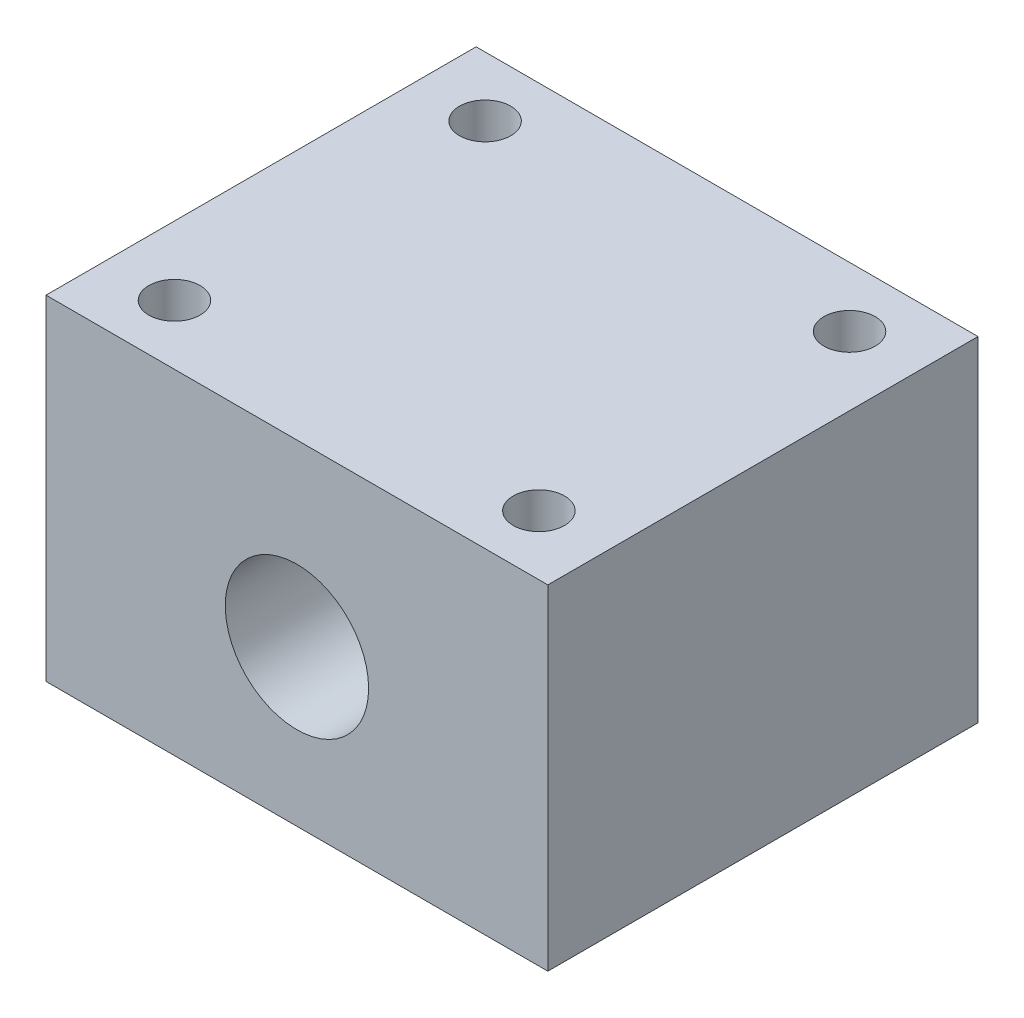
ISO-10303-21;
HEADER;
FILE_DESCRIPTION(('STEP AP214'),'2;1');
FILE_NAME('part.step','',(''),(''),'','','');
FILE_SCHEMA(('AUTOMOTIVE_DESIGN { 1 0 10303 214 1 1 1 1 }'));
ENDSEC;
DATA;
#1=APPLICATION_CONTEXT('core data for automotive mechanical design processes');
#2=APPLICATION_PROTOCOL_DEFINITION('international standard','automotive_design',2000,#1);
#3=PRODUCT_CONTEXT('',#1,'mechanical');
#4=PRODUCT('Part','Part','',(#3));
#5=PRODUCT_RELATED_PRODUCT_CATEGORY('part','',(#4));
#6=PRODUCT_DEFINITION_FORMATION('','',#4);
#7=PRODUCT_DEFINITION_CONTEXT('part definition',#1,'design');
#8=PRODUCT_DEFINITION('design','',#6,#7);
#9=PRODUCT_DEFINITION_SHAPE('','',#8);
#10=(LENGTH_UNIT() NAMED_UNIT(*) SI_UNIT(.MILLI.,.METRE.));
#11=(NAMED_UNIT(*) PLANE_ANGLE_UNIT() SI_UNIT($,.RADIAN.));
#12=(NAMED_UNIT(*) SI_UNIT($,.STERADIAN.) SOLID_ANGLE_UNIT());
#13=UNCERTAINTY_MEASURE_WITH_UNIT(LENGTH_MEASURE(1.E-05),#10,'distance_accuracy_value','');
#14=(GEOMETRIC_REPRESENTATION_CONTEXT(3) GLOBAL_UNCERTAINTY_ASSIGNED_CONTEXT((#13)) GLOBAL_UNIT_ASSIGNED_CONTEXT((#10,
#11,#12)) REPRESENTATION_CONTEXT('',''));
#15=CARTESIAN_POINT('',(0.,0.,0.));
#16=DIRECTION('',(0.,0.,1.));
#17=DIRECTION('',(1.,0.,0.));
#18=AXIS2_PLACEMENT_3D('',#15,#16,#17);
#19=CARTESIAN_POINT('',(-21.,-13.,36.));
#20=DIRECTION('',(0.,0.,1.));
#21=DIRECTION('',(1.,0.,0.));
#22=AXIS2_PLACEMENT_3D('',#19,#20,#21);
#23=PLANE('',#22);
#24=DIRECTION('',(0.,-1.,0.));
#25=VECTOR('',#24,1.);
#26=CARTESIAN_POINT('',(-21.,15.,36.));
#27=LINE('',#26,#25);
#28=CARTESIAN_POINT('',(-21.,15.,36.));
#29=VERTEX_POINT('',#28);
#30=CARTESIAN_POINT('',(-21.,-13.,36.));
#31=VERTEX_POINT('',#30);
#32=EDGE_CURVE('E85',#29,#31,#27,.T.);
#33=ORIENTED_EDGE('',*,*,#32,.T.);
#34=DIRECTION('',(1.,0.,0.));
#35=VECTOR('',#34,1.);
#36=CARTESIAN_POINT('',(-21.,-13.,36.));
#37=LINE('',#36,#35);
#38=CARTESIAN_POINT('',(21.,-13.,36.));
#39=VERTEX_POINT('',#38);
#40=EDGE_CURVE('E80',#31,#39,#37,.T.);
#41=ORIENTED_EDGE('',*,*,#40,.T.);
#42=DIRECTION('',(0.,1.,0.));
#43=VECTOR('',#42,1.);
#44=CARTESIAN_POINT('',(21.,15.,36.));
#45=LINE('',#44,#43);
#46=CARTESIAN_POINT('',(21.,15.,36.));
#47=VERTEX_POINT('',#46);
#48=EDGE_CURVE('E83',#39,#47,#45,.T.);
#49=ORIENTED_EDGE('',*,*,#48,.T.);
#50=DIRECTION('',(-1.,0.,0.));
#51=VECTOR('',#50,1.);
#52=CARTESIAN_POINT('',(-21.,15.,36.));
#53=LINE('',#52,#51);
#54=EDGE_CURVE('E50',#47,#29,#53,.T.);
#55=ORIENTED_EDGE('',*,*,#54,.T.);
#56=EDGE_LOOP('',(#33,#41,#49,#55));
#57=FACE_BOUND('',#56,.T.);
#58=CARTESIAN_POINT('',(0.,0.,36.));
#59=DIRECTION('',(0.,0.,1.));
#60=DIRECTION('',(1.,0.,0.));
#61=AXIS2_PLACEMENT_3D('',#58,#59,#60);
#62=CIRCLE('',#61,6.);
#63=CARTESIAN_POINT('',(6.,0.,36.));
#64=VERTEX_POINT('',#63);
#65=EDGE_CURVE('E100',#64,#64,#62,.T.);
#66=ORIENTED_EDGE('',*,*,#65,.F.);
#67=EDGE_LOOP('',(#66));
#68=FACE_BOUND('',#67,.T.);
#69=ADVANCED_FACE('F33',(#57,#68),#23,.T.);
#70=CARTESIAN_POINT('',(-21.,-13.,0.));
#71=DIRECTION('',(0.,0.,1.));
#72=DIRECTION('',(1.,0.,0.));
#73=AXIS2_PLACEMENT_3D('',#70,#71,#72);
#74=PLANE('',#73);
#75=DIRECTION('',(0.,-1.,0.));
#76=VECTOR('',#75,1.);
#77=CARTESIAN_POINT('',(-21.,15.,0.));
#78=LINE('',#77,#76);
#79=CARTESIAN_POINT('',(-21.,15.,0.));
#80=VERTEX_POINT('',#79);
#81=CARTESIAN_POINT('',(-21.,-13.,0.));
#82=VERTEX_POINT('',#81);
#83=EDGE_CURVE('E97',#80,#82,#78,.T.);
#84=ORIENTED_EDGE('',*,*,#83,.F.);
#85=DIRECTION('',(-1.,0.,0.));
#86=VECTOR('',#85,1.);
#87=CARTESIAN_POINT('',(-21.,15.,0.));
#88=LINE('',#87,#86);
#89=CARTESIAN_POINT('',(21.,15.,0.));
#90=VERTEX_POINT('',#89);
#91=EDGE_CURVE('E73',#90,#80,#88,.T.);
#92=ORIENTED_EDGE('',*,*,#91,.F.);
#93=DIRECTION('',(0.,1.,0.));
#94=VECTOR('',#93,1.);
#95=CARTESIAN_POINT('',(21.,15.,0.));
#96=LINE('',#95,#94);
#97=CARTESIAN_POINT('',(21.,-13.,0.));
#98=VERTEX_POINT('',#97);
#99=EDGE_CURVE('E67',#98,#90,#96,.T.);
#100=ORIENTED_EDGE('',*,*,#99,.F.);
#101=DIRECTION('',(1.,0.,0.));
#102=VECTOR('',#101,1.);
#103=CARTESIAN_POINT('',(-21.,-13.,0.));
#104=LINE('',#103,#102);
#105=EDGE_CURVE('E89',#82,#98,#104,.T.);
#106=ORIENTED_EDGE('',*,*,#105,.F.);
#107=EDGE_LOOP('',(#84,#92,#100,#106));
#108=FACE_BOUND('',#107,.T.);
#109=CARTESIAN_POINT('',(0.,0.,0.));
#110=DIRECTION('',(0.,0.,1.));
#111=DIRECTION('',(1.,0.,0.));
#112=AXIS2_PLACEMENT_3D('',#109,#110,#111);
#113=CIRCLE('',#112,6.);
#114=CARTESIAN_POINT('',(6.,0.,0.));
#115=VERTEX_POINT('',#114);
#116=EDGE_CURVE('E112',#115,#115,#113,.T.);
#117=ORIENTED_EDGE('',*,*,#116,.T.);
#118=EDGE_LOOP('',(#117));
#119=FACE_BOUND('',#118,.T.);
#120=ADVANCED_FACE('F108',(#108,#119),#74,.F.);
#121=CARTESIAN_POINT('',(-21.,15.,36.));
#122=DIRECTION('',(1.,0.,0.));
#123=DIRECTION('',(0.,1.,0.));
#124=AXIS2_PLACEMENT_3D('',#121,#122,#123);
#125=PLANE('',#124);
#126=ORIENTED_EDGE('',*,*,#83,.T.);
#127=DIRECTION('',(0.,0.,-1.));
#128=VECTOR('',#127,1.);
#129=CARTESIAN_POINT('',(-21.,-13.,36.));
#130=LINE('',#129,#128);
#131=EDGE_CURVE('E11',#31,#82,#130,.T.);
#132=ORIENTED_EDGE('',*,*,#131,.F.);
#133=ORIENTED_EDGE('',*,*,#32,.F.);
#134=DIRECTION('',(0.,0.,-1.));
#135=VECTOR('',#134,1.);
#136=CARTESIAN_POINT('',(-21.,15.,36.));
#137=LINE('',#136,#135);
#138=EDGE_CURVE('E93',#29,#80,#137,.T.);
#139=ORIENTED_EDGE('',*,*,#138,.T.);
#140=EDGE_LOOP('',(#126,#132,#133,#139));
#141=FACE_BOUND('',#140,.T.);
#142=ADVANCED_FACE('F35',(#141),#125,.F.);
#143=CARTESIAN_POINT('',(-21.,-13.,36.));
#144=DIRECTION('',(0.,1.,0.));
#145=DIRECTION('',(-1.,0.,0.));
#146=AXIS2_PLACEMENT_3D('',#143,#144,#145);
#147=PLANE('',#146);
#148=CARTESIAN_POINT('',(-15.25,-13.,31.));
#149=DIRECTION('',(0.,1.,0.));
#150=DIRECTION('',(0.,0.,1.));
#151=AXIS2_PLACEMENT_3D('',#148,#149,#150);
#152=CIRCLE('',#151,2.1463);
#153=CARTESIAN_POINT('',(-15.25,-13.,33.1463));
#154=VERTEX_POINT('',#153);
#155=EDGE_CURVE('E133',#154,#154,#152,.T.);
#156=ORIENTED_EDGE('',*,*,#155,.T.);
#157=EDGE_LOOP('',(#156));
#158=FACE_BOUND('',#157,.T.);
#159=CARTESIAN_POINT('',(15.25,-13.,31.));
#160=DIRECTION('',(0.,1.,0.));
#161=DIRECTION('',(0.,0.,1.));
#162=AXIS2_PLACEMENT_3D('',#159,#160,#161);
#163=CIRCLE('',#162,2.1463);
#164=CARTESIAN_POINT('',(15.25,-13.,33.1463));
#165=VERTEX_POINT('',#164);
#166=EDGE_CURVE('E127',#165,#165,#163,.T.);
#167=ORIENTED_EDGE('',*,*,#166,.T.);
#168=EDGE_LOOP('',(#167));
#169=FACE_BOUND('',#168,.T.);
#170=CARTESIAN_POINT('',(15.25,-13.,5.));
#171=DIRECTION('',(0.,1.,0.));
#172=DIRECTION('',(0.,0.,1.));
#173=AXIS2_PLACEMENT_3D('',#170,#171,#172);
#174=CIRCLE('',#173,2.1463);
#175=CARTESIAN_POINT('',(15.25,-13.,7.1463));
#176=VERTEX_POINT('',#175);
#177=EDGE_CURVE('E121',#176,#176,#174,.T.);
#178=ORIENTED_EDGE('',*,*,#177,.T.);
#179=EDGE_LOOP('',(#178));
#180=FACE_BOUND('',#179,.T.);
#181=CARTESIAN_POINT('',(-15.25,-13.,5.));
#182=DIRECTION('',(0.,1.,0.));
#183=DIRECTION('',(0.,0.,1.));
#184=AXIS2_PLACEMENT_3D('',#181,#182,#183);
#185=CIRCLE('',#184,2.1463);
#186=CARTESIAN_POINT('',(-15.25,-13.,7.1463));
#187=VERTEX_POINT('',#186);
#188=EDGE_CURVE('E115',#187,#187,#185,.T.);
#189=ORIENTED_EDGE('',*,*,#188,.T.);
#190=EDGE_LOOP('',(#189));
#191=FACE_BOUND('',#190,.T.);
#192=ORIENTED_EDGE('',*,*,#105,.T.);
#193=DIRECTION('',(0.,0.,-1.));
#194=VECTOR('',#193,1.);
#195=CARTESIAN_POINT('',(21.,-13.,36.));
#196=LINE('',#195,#194);
#197=EDGE_CURVE('E42',#39,#98,#196,.T.);
#198=ORIENTED_EDGE('',*,*,#197,.F.);
#199=ORIENTED_EDGE('',*,*,#40,.F.);
#200=ORIENTED_EDGE('',*,*,#131,.T.);
#201=EDGE_LOOP('',(#192,#198,#199,#200));
#202=FACE_BOUND('',#201,.T.);
#203=ADVANCED_FACE('F88',(#158,#169,#180,#191,#202),#147,.F.);
#204=CARTESIAN_POINT('',(21.,15.,36.));
#205=DIRECTION('',(-1.,0.,0.));
#206=DIRECTION('',(0.,0.,1.));
#207=AXIS2_PLACEMENT_3D('',#204,#205,#206);
#208=PLANE('',#207);
#209=ORIENTED_EDGE('',*,*,#99,.T.);
#210=DIRECTION('',(0.,0.,-1.));
#211=VECTOR('',#210,1.);
#212=CARTESIAN_POINT('',(21.,15.,36.));
#213=LINE('',#212,#211);
#214=EDGE_CURVE('E90',#47,#90,#213,.T.);
#215=ORIENTED_EDGE('',*,*,#214,.F.);
#216=ORIENTED_EDGE('',*,*,#48,.F.);
#217=ORIENTED_EDGE('',*,*,#197,.T.);
#218=EDGE_LOOP('',(#209,#215,#216,#217));
#219=FACE_BOUND('',#218,.T.);
#220=ADVANCED_FACE('F91',(#219),#208,.F.);
#221=CARTESIAN_POINT('',(-21.,15.,36.));
#222=DIRECTION('',(0.,-1.,0.));
#223=DIRECTION('',(0.,0.,-1.));
#224=AXIS2_PLACEMENT_3D('',#221,#222,#223);
#225=PLANE('',#224);
#226=CARTESIAN_POINT('',(-15.25,15.,31.));
#227=DIRECTION('',(0.,1.,0.));
#228=DIRECTION('',(0.,0.,1.));
#229=AXIS2_PLACEMENT_3D('',#226,#227,#228);
#230=CIRCLE('',#229,2.1463);
#231=CARTESIAN_POINT('',(-15.25,15.,33.1463));
#232=VERTEX_POINT('',#231);
#233=EDGE_CURVE('E136',#232,#232,#230,.T.);
#234=ORIENTED_EDGE('',*,*,#233,.F.);
#235=EDGE_LOOP('',(#234));
#236=FACE_BOUND('',#235,.T.);
#237=CARTESIAN_POINT('',(15.25,15.,31.));
#238=DIRECTION('',(0.,1.,0.));
#239=DIRECTION('',(0.,0.,1.));
#240=AXIS2_PLACEMENT_3D('',#237,#238,#239);
#241=CIRCLE('',#240,2.1463);
#242=CARTESIAN_POINT('',(15.25,15.,33.1463));
#243=VERTEX_POINT('',#242);
#244=EDGE_CURVE('E130',#243,#243,#241,.T.);
#245=ORIENTED_EDGE('',*,*,#244,.F.);
#246=EDGE_LOOP('',(#245));
#247=FACE_BOUND('',#246,.T.);
#248=CARTESIAN_POINT('',(15.25,15.,5.));
#249=DIRECTION('',(0.,1.,0.));
#250=DIRECTION('',(0.,0.,1.));
#251=AXIS2_PLACEMENT_3D('',#248,#249,#250);
#252=CIRCLE('',#251,2.1463);
#253=CARTESIAN_POINT('',(15.25,15.,7.1463));
#254=VERTEX_POINT('',#253);
#255=EDGE_CURVE('E124',#254,#254,#252,.T.);
#256=ORIENTED_EDGE('',*,*,#255,.F.);
#257=EDGE_LOOP('',(#256));
#258=FACE_BOUND('',#257,.T.);
#259=CARTESIAN_POINT('',(-15.25,15.,5.));
#260=DIRECTION('',(0.,1.,0.));
#261=DIRECTION('',(0.,0.,1.));
#262=AXIS2_PLACEMENT_3D('',#259,#260,#261);
#263=CIRCLE('',#262,2.1463);
#264=CARTESIAN_POINT('',(-15.25,15.,7.1463));
#265=VERTEX_POINT('',#264);
#266=EDGE_CURVE('E118',#265,#265,#263,.T.);
#267=ORIENTED_EDGE('',*,*,#266,.F.);
#268=EDGE_LOOP('',(#267));
#269=FACE_BOUND('',#268,.T.);
#270=ORIENTED_EDGE('',*,*,#91,.T.);
#271=ORIENTED_EDGE('',*,*,#138,.F.);
#272=ORIENTED_EDGE('',*,*,#54,.F.);
#273=ORIENTED_EDGE('',*,*,#214,.T.);
#274=EDGE_LOOP('',(#270,#271,#272,#273));
#275=FACE_BOUND('',#274,.T.);
#276=ADVANCED_FACE('F105',(#236,#247,#258,#269,#275),#225,.F.);
#277=CARTESIAN_POINT('',(0.,0.,36.));
#278=DIRECTION('',(0.,0.,-1.));
#279=DIRECTION('',(-1.,0.,0.));
#280=AXIS2_PLACEMENT_3D('',#277,#278,#279);
#281=CYLINDRICAL_SURFACE('',#280,6.);
#282=ORIENTED_EDGE('',*,*,#65,.T.);
#283=EDGE_LOOP('',(#282));
#284=FACE_BOUND('',#283,.T.);
#285=ORIENTED_EDGE('',*,*,#116,.F.);
#286=EDGE_LOOP('',(#285));
#287=FACE_BOUND('',#286,.T.);
#288=ADVANCED_FACE('F153',(#284,#287),#281,.F.);
#289=CARTESIAN_POINT('',(-15.25,-13.,5.));
#290=DIRECTION('',(0.,1.,0.));
#291=DIRECTION('',(0.,0.,1.));
#292=AXIS2_PLACEMENT_3D('',#289,#290,#291);
#293=CYLINDRICAL_SURFACE('',#292,2.1463);
#294=ORIENTED_EDGE('',*,*,#188,.F.);
#295=EDGE_LOOP('',(#294));
#296=FACE_BOUND('',#295,.T.);
#297=ORIENTED_EDGE('',*,*,#266,.T.);
#298=EDGE_LOOP('',(#297));
#299=FACE_BOUND('',#298,.T.);
#300=ADVANCED_FACE('F161',(#296,#299),#293,.F.);
#301=CARTESIAN_POINT('',(15.25,-13.,5.));
#302=DIRECTION('',(0.,1.,0.));
#303=DIRECTION('',(0.,0.,1.));
#304=AXIS2_PLACEMENT_3D('',#301,#302,#303);
#305=CYLINDRICAL_SURFACE('',#304,2.1463);
#306=ORIENTED_EDGE('',*,*,#177,.F.);
#307=EDGE_LOOP('',(#306));
#308=FACE_BOUND('',#307,.T.);
#309=ORIENTED_EDGE('',*,*,#255,.T.);
#310=EDGE_LOOP('',(#309));
#311=FACE_BOUND('',#310,.T.);
#312=ADVANCED_FACE('F163',(#308,#311),#305,.F.);
#313=CARTESIAN_POINT('',(15.25,-13.,31.));
#314=DIRECTION('',(0.,1.,0.));
#315=DIRECTION('',(0.,0.,1.));
#316=AXIS2_PLACEMENT_3D('',#313,#314,#315);
#317=CYLINDRICAL_SURFACE('',#316,2.1463);
#318=ORIENTED_EDGE('',*,*,#166,.F.);
#319=EDGE_LOOP('',(#318));
#320=FACE_BOUND('',#319,.T.);
#321=ORIENTED_EDGE('',*,*,#244,.T.);
#322=EDGE_LOOP('',(#321));
#323=FACE_BOUND('',#322,.T.);
#324=ADVANCED_FACE('F147',(#320,#323),#317,.F.);
#325=CARTESIAN_POINT('',(-15.25,-13.,31.));
#326=DIRECTION('',(0.,1.,0.));
#327=DIRECTION('',(0.,0.,1.));
#328=AXIS2_PLACEMENT_3D('',#325,#326,#327);
#329=CYLINDRICAL_SURFACE('',#328,2.1463);
#330=ORIENTED_EDGE('',*,*,#155,.F.);
#331=EDGE_LOOP('',(#330));
#332=FACE_BOUND('',#331,.T.);
#333=ORIENTED_EDGE('',*,*,#233,.T.);
#334=EDGE_LOOP('',(#333));
#335=FACE_BOUND('',#334,.T.);
#336=ADVANCED_FACE('F144',(#332,#335),#329,.F.);
#337=CLOSED_SHELL('',(#69,#120,#142,#203,#220,#276,#288,#300,#312,#324,#336));
#338=MANIFOLD_SOLID_BREP('B2',#337);
#339=ADVANCED_BREP_SHAPE_REPRESENTATION('',(#18,#338),#14);
#340=SHAPE_DEFINITION_REPRESENTATION(#9,#339);
ENDSEC;
END-ISO-10303-21;
